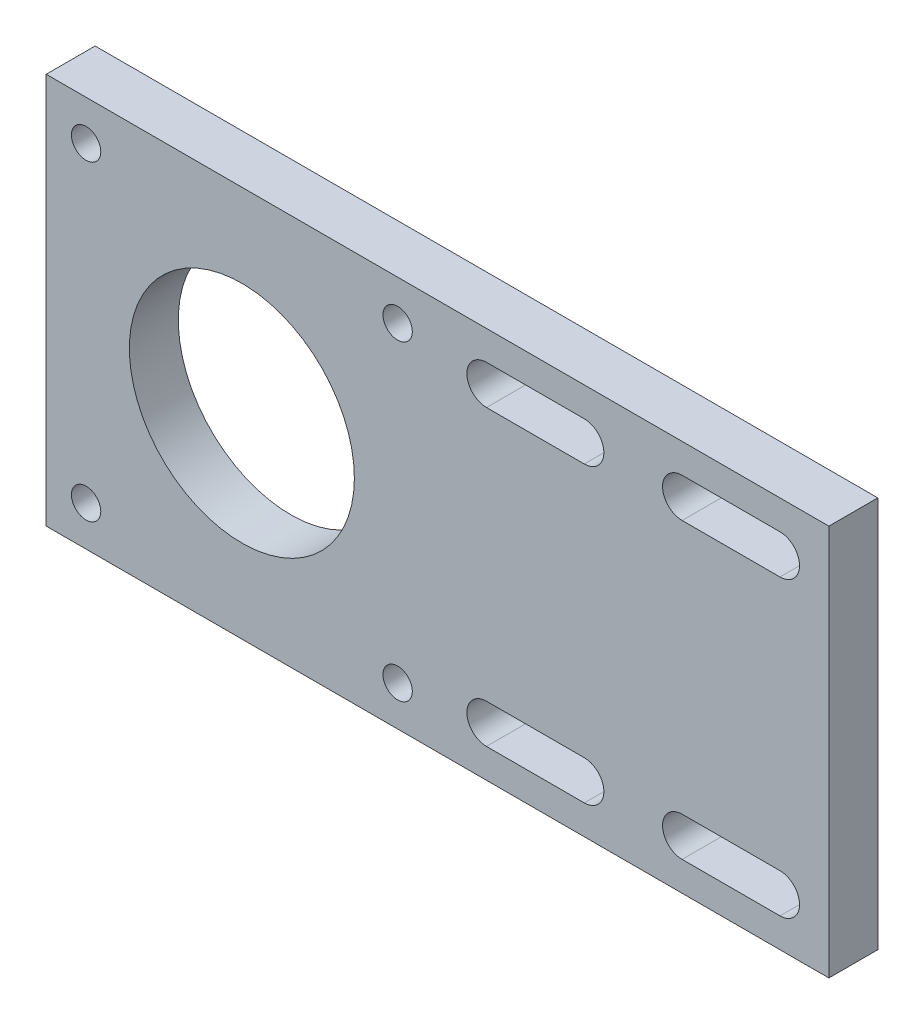
ISO-10303-21;
HEADER;
FILE_DESCRIPTION(('STEP AP214'),'2;1');
FILE_NAME('part.step','',(''),(''),'','','');
FILE_SCHEMA(('AUTOMOTIVE_DESIGN { 1 0 10303 214 1 1 1 1 }'));
ENDSEC;
DATA;
#1=APPLICATION_CONTEXT('core data for automotive mechanical design processes');
#2=APPLICATION_PROTOCOL_DEFINITION('international standard','automotive_design',2000,#1);
#3=PRODUCT_CONTEXT('',#1,'mechanical');
#4=PRODUCT('Part','Part','',(#3));
#5=PRODUCT_RELATED_PRODUCT_CATEGORY('part','',(#4));
#6=PRODUCT_DEFINITION_FORMATION('','',#4);
#7=PRODUCT_DEFINITION_CONTEXT('part definition',#1,'design');
#8=PRODUCT_DEFINITION('design','',#6,#7);
#9=PRODUCT_DEFINITION_SHAPE('','',#8);
#10=(LENGTH_UNIT() NAMED_UNIT(*) SI_UNIT(.MILLI.,.METRE.));
#11=(NAMED_UNIT(*) PLANE_ANGLE_UNIT() SI_UNIT($,.RADIAN.));
#12=(NAMED_UNIT(*) SI_UNIT($,.STERADIAN.) SOLID_ANGLE_UNIT());
#13=UNCERTAINTY_MEASURE_WITH_UNIT(LENGTH_MEASURE(1.E-05),#10,'distance_accuracy_value','');
#14=(GEOMETRIC_REPRESENTATION_CONTEXT(3) GLOBAL_UNCERTAINTY_ASSIGNED_CONTEXT((#13)) GLOBAL_UNIT_ASSIGNED_CONTEXT((#10,
#11,#12)) REPRESENTATION_CONTEXT('',''));
#15=CARTESIAN_POINT('',(0.,0.,0.));
#16=DIRECTION('',(0.,0.,1.));
#17=DIRECTION('',(1.,0.,0.));
#18=AXIS2_PLACEMENT_3D('',#15,#16,#17);
#19=CARTESIAN_POINT('',(0.,0.,5.));
#20=DIRECTION('',(0.,0.,1.));
#21=DIRECTION('',(1.,0.,0.));
#22=AXIS2_PLACEMENT_3D('',#19,#20,#21);
#23=PLANE('',#22);
#24=CARTESIAN_POINT('',(-15.922,-15.922,5.));
#25=DIRECTION('',(0.,0.,1.));
#26=DIRECTION('',(1.,0.,0.));
#27=AXIS2_PLACEMENT_3D('',#24,#25,#26);
#28=CIRCLE('',#27,1.5);
#29=CARTESIAN_POINT('',(-14.422,-15.922,5.));
#30=VERTEX_POINT('',#29);
#31=EDGE_CURVE('E475',#30,#30,#28,.T.);
#32=ORIENTED_EDGE('',*,*,#31,.F.);
#33=EDGE_LOOP('',(#32));
#34=FACE_BOUND('',#33,.T.);
#35=CARTESIAN_POINT('',(15.922,15.922,5.));
#36=DIRECTION('',(0.,0.,1.));
#37=DIRECTION('',(1.,0.,0.));
#38=AXIS2_PLACEMENT_3D('',#35,#36,#37);
#39=CIRCLE('',#38,1.5);
#40=CARTESIAN_POINT('',(17.422,15.922,5.));
#41=VERTEX_POINT('',#40);
#42=EDGE_CURVE('E487',#41,#41,#39,.T.);
#43=ORIENTED_EDGE('',*,*,#42,.F.);
#44=EDGE_LOOP('',(#43));
#45=FACE_BOUND('',#44,.T.);
#46=DIRECTION('',(1.,0.,0.));
#47=VECTOR('',#46,1.);
#48=CARTESIAN_POINT('',(25.,-17.,5.));
#49=LINE('',#48,#47);
#50=CARTESIAN_POINT('',(25.,-17.,5.));
#51=VERTEX_POINT('',#50);
#52=CARTESIAN_POINT('',(35.,-17.,5.));
#53=VERTEX_POINT('',#52);
#54=EDGE_CURVE('E178',#51,#53,#49,.T.);
#55=ORIENTED_EDGE('',*,*,#54,.F.);
#56=CARTESIAN_POINT('',(25.,-15.,5.));
#57=DIRECTION('',(0.,0.,1.));
#58=DIRECTION('',(1.,0.,0.));
#59=AXIS2_PLACEMENT_3D('',#56,#57,#58);
#60=CIRCLE('',#59,2.00000000000001);
#61=CARTESIAN_POINT('',(25.,-13.,5.));
#62=VERTEX_POINT('',#61);
#63=EDGE_CURVE('E170',#62,#51,#60,.T.);
#64=ORIENTED_EDGE('',*,*,#63,.F.);
#65=DIRECTION('',(-1.,0.,0.));
#66=VECTOR('',#65,1.);
#67=CARTESIAN_POINT('',(25.,-13.,5.));
#68=LINE('',#67,#66);
#69=CARTESIAN_POINT('',(35.,-13.,5.));
#70=VERTEX_POINT('',#69);
#71=EDGE_CURVE('E193',#70,#62,#68,.T.);
#72=ORIENTED_EDGE('',*,*,#71,.F.);
#73=CARTESIAN_POINT('',(35.,-15.,5.));
#74=DIRECTION('',(0.,0.,1.));
#75=DIRECTION('',(1.,0.,0.));
#76=AXIS2_PLACEMENT_3D('',#73,#74,#75);
#77=CIRCLE('',#76,2.00000000000001);
#78=EDGE_CURVE('E191',#53,#70,#77,.T.);
#79=ORIENTED_EDGE('',*,*,#78,.F.);
#80=EDGE_LOOP('',(#55,#64,#72,#79));
#81=FACE_BOUND('',#80,.T.);
#82=DIRECTION('',(1.,0.,0.));
#83=VECTOR('',#82,1.);
#84=CARTESIAN_POINT('',(45.,-17.,5.));
#85=LINE('',#84,#83);
#86=CARTESIAN_POINT('',(45.,-17.,5.));
#87=VERTEX_POINT('',#86);
#88=CARTESIAN_POINT('',(55.,-17.,5.));
#89=VERTEX_POINT('',#88);
#90=EDGE_CURVE('E211',#87,#89,#85,.T.);
#91=ORIENTED_EDGE('',*,*,#90,.F.);
#92=CARTESIAN_POINT('',(45.,-15.,5.));
#93=DIRECTION('',(0.,0.,1.));
#94=DIRECTION('',(1.,0.,0.));
#95=AXIS2_PLACEMENT_3D('',#92,#93,#94);
#96=CIRCLE('',#95,2.);
#97=CARTESIAN_POINT('',(45.,-13.,5.));
#98=VERTEX_POINT('',#97);
#99=EDGE_CURVE('E209',#98,#87,#96,.T.);
#100=ORIENTED_EDGE('',*,*,#99,.F.);
#101=DIRECTION('',(-1.,0.,0.));
#102=VECTOR('',#101,1.);
#103=CARTESIAN_POINT('',(45.,-13.,5.));
#104=LINE('',#103,#102);
#105=CARTESIAN_POINT('',(55.,-13.,5.));
#106=VERTEX_POINT('',#105);
#107=EDGE_CURVE('E217',#106,#98,#104,.T.);
#108=ORIENTED_EDGE('',*,*,#107,.F.);
#109=CARTESIAN_POINT('',(55.,-15.,5.));
#110=DIRECTION('',(0.,0.,1.));
#111=DIRECTION('',(1.,0.,0.));
#112=AXIS2_PLACEMENT_3D('',#109,#110,#111);
#113=CIRCLE('',#112,2.);
#114=EDGE_CURVE('E214',#89,#106,#113,.T.);
#115=ORIENTED_EDGE('',*,*,#114,.F.);
#116=EDGE_LOOP('',(#91,#100,#108,#115));
#117=FACE_BOUND('',#116,.T.);
#118=DIRECTION('',(1.,0.,0.));
#119=VECTOR('',#118,1.);
#120=CARTESIAN_POINT('',(45.,13.,5.));
#121=LINE('',#120,#119);
#122=CARTESIAN_POINT('',(45.,13.,5.));
#123=VERTEX_POINT('',#122);
#124=CARTESIAN_POINT('',(55.,13.,5.));
#125=VERTEX_POINT('',#124);
#126=EDGE_CURVE('E242',#123,#125,#121,.T.);
#127=ORIENTED_EDGE('',*,*,#126,.F.);
#128=CARTESIAN_POINT('',(45.,15.,5.));
#129=DIRECTION('',(0.,0.,1.));
#130=DIRECTION('',(1.,0.,0.));
#131=AXIS2_PLACEMENT_3D('',#128,#129,#130);
#132=CIRCLE('',#131,2.);
#133=CARTESIAN_POINT('',(45.,17.,5.));
#134=VERTEX_POINT('',#133);
#135=EDGE_CURVE('E240',#134,#123,#132,.T.);
#136=ORIENTED_EDGE('',*,*,#135,.F.);
#137=DIRECTION('',(-1.,0.,0.));
#138=VECTOR('',#137,1.);
#139=CARTESIAN_POINT('',(45.,17.,5.));
#140=LINE('',#139,#138);
#141=CARTESIAN_POINT('',(55.,17.,5.));
#142=VERTEX_POINT('',#141);
#143=EDGE_CURVE('E248',#142,#134,#140,.T.);
#144=ORIENTED_EDGE('',*,*,#143,.F.);
#145=CARTESIAN_POINT('',(55.,15.,5.));
#146=DIRECTION('',(0.,0.,1.));
#147=DIRECTION('',(1.,0.,0.));
#148=AXIS2_PLACEMENT_3D('',#145,#146,#147);
#149=CIRCLE('',#148,2.);
#150=EDGE_CURVE('E245',#125,#142,#149,.T.);
#151=ORIENTED_EDGE('',*,*,#150,.F.);
#152=EDGE_LOOP('',(#127,#136,#144,#151));
#153=FACE_BOUND('',#152,.T.);
#154=DIRECTION('',(1.,0.,0.));
#155=VECTOR('',#154,1.);
#156=CARTESIAN_POINT('',(25.,13.,5.));
#157=LINE('',#156,#155);
#158=CARTESIAN_POINT('',(25.,13.,5.));
#159=VERTEX_POINT('',#158);
#160=CARTESIAN_POINT('',(35.,13.,5.));
#161=VERTEX_POINT('',#160);
#162=EDGE_CURVE('E273',#159,#161,#157,.T.);
#163=ORIENTED_EDGE('',*,*,#162,.F.);
#164=CARTESIAN_POINT('',(25.,15.,5.));
#165=DIRECTION('',(0.,0.,1.));
#166=DIRECTION('',(1.,0.,0.));
#167=AXIS2_PLACEMENT_3D('',#164,#165,#166);
#168=CIRCLE('',#167,2.);
#169=CARTESIAN_POINT('',(25.,17.,5.));
#170=VERTEX_POINT('',#169);
#171=EDGE_CURVE('E271',#170,#159,#168,.T.);
#172=ORIENTED_EDGE('',*,*,#171,.F.);
#173=DIRECTION('',(-1.,0.,0.));
#174=VECTOR('',#173,1.);
#175=CARTESIAN_POINT('',(25.,17.,5.));
#176=LINE('',#175,#174);
#177=CARTESIAN_POINT('',(35.,17.,5.));
#178=VERTEX_POINT('',#177);
#179=EDGE_CURVE('E279',#178,#170,#176,.T.);
#180=ORIENTED_EDGE('',*,*,#179,.F.);
#181=CARTESIAN_POINT('',(35.,15.,5.));
#182=DIRECTION('',(0.,0.,1.));
#183=DIRECTION('',(1.,0.,0.));
#184=AXIS2_PLACEMENT_3D('',#181,#182,#183);
#185=CIRCLE('',#184,2.);
#186=EDGE_CURVE('E276',#161,#178,#185,.T.);
#187=ORIENTED_EDGE('',*,*,#186,.F.);
#188=EDGE_LOOP('',(#163,#172,#180,#187));
#189=FACE_BOUND('',#188,.T.);
#190=DIRECTION('',(-1.,0.,0.));
#191=VECTOR('',#190,1.);
#192=CARTESIAN_POINT('',(60.,20.,5.));
#193=LINE('',#192,#191);
#194=CARTESIAN_POINT('',(60.,20.,5.));
#195=VERTEX_POINT('',#194);
#196=CARTESIAN_POINT('',(-20.,20.,5.));
#197=VERTEX_POINT('',#196);
#198=EDGE_CURVE('E302',#195,#197,#193,.T.);
#199=ORIENTED_EDGE('',*,*,#198,.T.);
#200=DIRECTION('',(0.,-1.,0.));
#201=VECTOR('',#200,1.);
#202=CARTESIAN_POINT('',(-20.,20.,5.));
#203=LINE('',#202,#201);
#204=CARTESIAN_POINT('',(-20.,-20.,5.));
#205=VERTEX_POINT('',#204);
#206=EDGE_CURVE('E305',#197,#205,#203,.T.);
#207=ORIENTED_EDGE('',*,*,#206,.T.);
#208=DIRECTION('',(1.,0.,0.));
#209=VECTOR('',#208,1.);
#210=CARTESIAN_POINT('',(-20.,-20.,5.));
#211=LINE('',#210,#209);
#212=CARTESIAN_POINT('',(60.,-20.,5.));
#213=VERTEX_POINT('',#212);
#214=EDGE_CURVE('E308',#205,#213,#211,.T.);
#215=ORIENTED_EDGE('',*,*,#214,.T.);
#216=DIRECTION('',(0.,1.,0.));
#217=VECTOR('',#216,1.);
#218=CARTESIAN_POINT('',(60.,-20.,5.));
#219=LINE('',#218,#217);
#220=EDGE_CURVE('E310',#213,#195,#219,.T.);
#221=ORIENTED_EDGE('',*,*,#220,.T.);
#222=EDGE_LOOP('',(#199,#207,#215,#221));
#223=FACE_BOUND('',#222,.T.);
#224=CARTESIAN_POINT('',(-15.922,15.922,5.));
#225=DIRECTION('',(0.,0.,1.));
#226=DIRECTION('',(1.,0.,0.));
#227=AXIS2_PLACEMENT_3D('',#224,#225,#226);
#228=CIRCLE('',#227,1.5);
#229=CARTESIAN_POINT('',(-14.422,15.922,5.));
#230=VERTEX_POINT('',#229);
#231=EDGE_CURVE('E199',#230,#230,#228,.T.);
#232=ORIENTED_EDGE('',*,*,#231,.F.);
#233=EDGE_LOOP('',(#232));
#234=FACE_BOUND('',#233,.T.);
#235=CARTESIAN_POINT('',(15.922,-15.922,5.));
#236=DIRECTION('',(0.,0.,1.));
#237=DIRECTION('',(1.,0.,0.));
#238=AXIS2_PLACEMENT_3D('',#235,#236,#237);
#239=CIRCLE('',#238,1.5);
#240=CARTESIAN_POINT('',(17.422,-15.922,5.));
#241=VERTEX_POINT('',#240);
#242=EDGE_CURVE('E481',#241,#241,#239,.T.);
#243=ORIENTED_EDGE('',*,*,#242,.F.);
#244=EDGE_LOOP('',(#243));
#245=FACE_BOUND('',#244,.T.);
#246=CARTESIAN_POINT('',(0.,0.,5.));
#247=DIRECTION('',(0.,0.,1.));
#248=DIRECTION('',(1.,0.,0.));
#249=AXIS2_PLACEMENT_3D('',#246,#247,#248);
#250=CIRCLE('',#249,11.5);
#251=CARTESIAN_POINT('',(11.5,0.,5.));
#252=VERTEX_POINT('',#251);
#253=EDGE_CURVE('E466',#252,#252,#250,.T.);
#254=ORIENTED_EDGE('',*,*,#253,.F.);
#255=EDGE_LOOP('',(#254));
#256=FACE_BOUND('',#255,.T.);
#257=ADVANCED_FACE('F33',(#34,#45,#81,#117,#153,#189,#223,#234,#245,#256),#23,.T.);
#258=CARTESIAN_POINT('',(0.,0.,0.));
#259=DIRECTION('',(0.,0.,1.));
#260=DIRECTION('',(1.,0.,0.));
#261=AXIS2_PLACEMENT_3D('',#258,#259,#260);
#262=PLANE('',#261);
#263=CARTESIAN_POINT('',(45.,-15.,0.));
#264=DIRECTION('',(0.,0.,1.));
#265=DIRECTION('',(1.,0.,0.));
#266=AXIS2_PLACEMENT_3D('',#263,#264,#265);
#267=CIRCLE('',#266,2.);
#268=CARTESIAN_POINT('',(45.,-13.,0.));
#269=VERTEX_POINT('',#268);
#270=CARTESIAN_POINT('',(45.,-17.,0.));
#271=VERTEX_POINT('',#270);
#272=EDGE_CURVE('E186',#269,#271,#267,.T.);
#273=ORIENTED_EDGE('',*,*,#272,.T.);
#274=DIRECTION('',(1.,0.,0.));
#275=VECTOR('',#274,1.);
#276=CARTESIAN_POINT('',(45.,-17.,0.));
#277=LINE('',#276,#275);
#278=CARTESIAN_POINT('',(55.,-17.,0.));
#279=VERTEX_POINT('',#278);
#280=EDGE_CURVE('E222',#271,#279,#277,.T.);
#281=ORIENTED_EDGE('',*,*,#280,.T.);
#282=CARTESIAN_POINT('',(55.,-15.,0.));
#283=DIRECTION('',(0.,0.,1.));
#284=DIRECTION('',(1.,0.,0.));
#285=AXIS2_PLACEMENT_3D('',#282,#283,#284);
#286=CIRCLE('',#285,2.);
#287=CARTESIAN_POINT('',(55.,-13.,0.));
#288=VERTEX_POINT('',#287);
#289=EDGE_CURVE('E225',#279,#288,#286,.T.);
#290=ORIENTED_EDGE('',*,*,#289,.T.);
#291=DIRECTION('',(-1.,0.,0.));
#292=VECTOR('',#291,1.);
#293=CARTESIAN_POINT('',(45.,-13.,0.));
#294=LINE('',#293,#292);
#295=EDGE_CURVE('E212',#288,#269,#294,.T.);
#296=ORIENTED_EDGE('',*,*,#295,.T.);
#297=EDGE_LOOP('',(#273,#281,#290,#296));
#298=FACE_BOUND('',#297,.T.);
#299=CARTESIAN_POINT('',(25.,15.,0.));
#300=DIRECTION('',(0.,0.,1.));
#301=DIRECTION('',(1.,0.,0.));
#302=AXIS2_PLACEMENT_3D('',#299,#300,#301);
#303=CIRCLE('',#302,2.);
#304=CARTESIAN_POINT('',(25.,17.,0.));
#305=VERTEX_POINT('',#304);
#306=CARTESIAN_POINT('',(25.,13.,0.));
#307=VERTEX_POINT('',#306);
#308=EDGE_CURVE('E270',#305,#307,#303,.T.);
#309=ORIENTED_EDGE('',*,*,#308,.T.);
#310=DIRECTION('',(1.,0.,0.));
#311=VECTOR('',#310,1.);
#312=CARTESIAN_POINT('',(25.,13.,0.));
#313=LINE('',#312,#311);
#314=CARTESIAN_POINT('',(35.,13.,0.));
#315=VERTEX_POINT('',#314);
#316=EDGE_CURVE('E284',#307,#315,#313,.T.);
#317=ORIENTED_EDGE('',*,*,#316,.T.);
#318=CARTESIAN_POINT('',(35.,15.,0.));
#319=DIRECTION('',(0.,0.,1.));
#320=DIRECTION('',(1.,0.,0.));
#321=AXIS2_PLACEMENT_3D('',#318,#319,#320);
#322=CIRCLE('',#321,2.);
#323=CARTESIAN_POINT('',(35.,17.,0.));
#324=VERTEX_POINT('',#323);
#325=EDGE_CURVE('E287',#315,#324,#322,.T.);
#326=ORIENTED_EDGE('',*,*,#325,.T.);
#327=DIRECTION('',(-1.,0.,0.));
#328=VECTOR('',#327,1.);
#329=CARTESIAN_POINT('',(25.,17.,0.));
#330=LINE('',#329,#328);
#331=EDGE_CURVE('E274',#324,#305,#330,.T.);
#332=ORIENTED_EDGE('',*,*,#331,.T.);
#333=EDGE_LOOP('',(#309,#317,#326,#332));
#334=FACE_BOUND('',#333,.T.);
#335=DIRECTION('',(-1.,0.,0.));
#336=VECTOR('',#335,1.);
#337=CARTESIAN_POINT('',(60.,20.,0.));
#338=LINE('',#337,#336);
#339=CARTESIAN_POINT('',(60.,20.,0.));
#340=VERTEX_POINT('',#339);
#341=CARTESIAN_POINT('',(-20.,20.,0.));
#342=VERTEX_POINT('',#341);
#343=EDGE_CURVE('E301',#340,#342,#338,.T.);
#344=ORIENTED_EDGE('',*,*,#343,.F.);
#345=DIRECTION('',(0.,1.,0.));
#346=VECTOR('',#345,1.);
#347=CARTESIAN_POINT('',(60.,-20.,0.));
#348=LINE('',#347,#346);
#349=CARTESIAN_POINT('',(60.,-20.,0.));
#350=VERTEX_POINT('',#349);
#351=EDGE_CURVE('E306',#350,#340,#348,.T.);
#352=ORIENTED_EDGE('',*,*,#351,.F.);
#353=DIRECTION('',(1.,0.,0.));
#354=VECTOR('',#353,1.);
#355=CARTESIAN_POINT('',(-20.,-20.,0.));
#356=LINE('',#355,#354);
#357=CARTESIAN_POINT('',(-20.,-20.,0.));
#358=VERTEX_POINT('',#357);
#359=EDGE_CURVE('E317',#358,#350,#356,.T.);
#360=ORIENTED_EDGE('',*,*,#359,.F.);
#361=DIRECTION('',(0.,-1.,0.));
#362=VECTOR('',#361,1.);
#363=CARTESIAN_POINT('',(-20.,20.,0.));
#364=LINE('',#363,#362);
#365=EDGE_CURVE('E315',#342,#358,#364,.T.);
#366=ORIENTED_EDGE('',*,*,#365,.F.);
#367=EDGE_LOOP('',(#344,#352,#360,#366));
#368=FACE_BOUND('',#367,.T.);
#369=CARTESIAN_POINT('',(45.,15.,0.));
#370=DIRECTION('',(0.,0.,1.));
#371=DIRECTION('',(1.,0.,0.));
#372=AXIS2_PLACEMENT_3D('',#369,#370,#371);
#373=CIRCLE('',#372,2.);
#374=CARTESIAN_POINT('',(45.,17.,0.));
#375=VERTEX_POINT('',#374);
#376=CARTESIAN_POINT('',(45.,13.,0.));
#377=VERTEX_POINT('',#376);
#378=EDGE_CURVE('E239',#375,#377,#373,.T.);
#379=ORIENTED_EDGE('',*,*,#378,.T.);
#380=DIRECTION('',(1.,0.,0.));
#381=VECTOR('',#380,1.);
#382=CARTESIAN_POINT('',(45.,13.,0.));
#383=LINE('',#382,#381);
#384=CARTESIAN_POINT('',(55.,13.,0.));
#385=VERTEX_POINT('',#384);
#386=EDGE_CURVE('E253',#377,#385,#383,.T.);
#387=ORIENTED_EDGE('',*,*,#386,.T.);
#388=CARTESIAN_POINT('',(55.,15.,0.));
#389=DIRECTION('',(0.,0.,1.));
#390=DIRECTION('',(1.,0.,0.));
#391=AXIS2_PLACEMENT_3D('',#388,#389,#390);
#392=CIRCLE('',#391,2.);
#393=CARTESIAN_POINT('',(55.,17.,0.));
#394=VERTEX_POINT('',#393);
#395=EDGE_CURVE('E256',#385,#394,#392,.T.);
#396=ORIENTED_EDGE('',*,*,#395,.T.);
#397=DIRECTION('',(-1.,0.,0.));
#398=VECTOR('',#397,1.);
#399=CARTESIAN_POINT('',(45.,17.,0.));
#400=LINE('',#399,#398);
#401=EDGE_CURVE('E243',#394,#375,#400,.T.);
#402=ORIENTED_EDGE('',*,*,#401,.T.);
#403=EDGE_LOOP('',(#379,#387,#396,#402));
#404=FACE_BOUND('',#403,.T.);
#405=CARTESIAN_POINT('',(25.,-15.,0.));
#406=DIRECTION('',(0.,0.,1.));
#407=DIRECTION('',(1.,0.,0.));
#408=AXIS2_PLACEMENT_3D('',#405,#406,#407);
#409=CIRCLE('',#408,2.00000000000001);
#410=CARTESIAN_POINT('',(25.,-13.,0.));
#411=VERTEX_POINT('',#410);
#412=CARTESIAN_POINT('',(25.,-17.,0.));
#413=VERTEX_POINT('',#412);
#414=EDGE_CURVE('E56',#411,#413,#409,.T.);
#415=ORIENTED_EDGE('',*,*,#414,.T.);
#416=DIRECTION('',(1.,0.,0.));
#417=VECTOR('',#416,1.);
#418=CARTESIAN_POINT('',(25.,-17.,0.));
#419=LINE('',#418,#417);
#420=CARTESIAN_POINT('',(35.,-17.,0.));
#421=VERTEX_POINT('',#420);
#422=EDGE_CURVE('E185',#413,#421,#419,.T.);
#423=ORIENTED_EDGE('',*,*,#422,.T.);
#424=CARTESIAN_POINT('',(35.,-15.,0.));
#425=DIRECTION('',(0.,0.,1.));
#426=DIRECTION('',(1.,0.,0.));
#427=AXIS2_PLACEMENT_3D('',#424,#425,#426);
#428=CIRCLE('',#427,2.00000000000001);
#429=CARTESIAN_POINT('',(35.,-13.,0.));
#430=VERTEX_POINT('',#429);
#431=EDGE_CURVE('E201',#421,#430,#428,.T.);
#432=ORIENTED_EDGE('',*,*,#431,.T.);
#433=DIRECTION('',(-1.,0.,0.));
#434=VECTOR('',#433,1.);
#435=CARTESIAN_POINT('',(25.,-13.,0.));
#436=LINE('',#435,#434);
#437=EDGE_CURVE('E179',#430,#411,#436,.T.);
#438=ORIENTED_EDGE('',*,*,#437,.T.);
#439=EDGE_LOOP('',(#415,#423,#432,#438));
#440=FACE_BOUND('',#439,.T.);
#441=CARTESIAN_POINT('',(-15.922,15.922,0.));
#442=DIRECTION('',(0.,0.,1.));
#443=DIRECTION('',(1.,0.,0.));
#444=AXIS2_PLACEMENT_3D('',#441,#442,#443);
#445=CIRCLE('',#444,1.5);
#446=CARTESIAN_POINT('',(-14.422,15.922,0.));
#447=VERTEX_POINT('',#446);
#448=EDGE_CURVE('E490',#447,#447,#445,.T.);
#449=ORIENTED_EDGE('',*,*,#448,.T.);
#450=EDGE_LOOP('',(#449));
#451=FACE_BOUND('',#450,.T.);
#452=CARTESIAN_POINT('',(15.922,15.922,0.));
#453=DIRECTION('',(0.,0.,1.));
#454=DIRECTION('',(1.,0.,0.));
#455=AXIS2_PLACEMENT_3D('',#452,#453,#454);
#456=CIRCLE('',#455,1.5);
#457=CARTESIAN_POINT('',(17.422,15.922,0.));
#458=VERTEX_POINT('',#457);
#459=EDGE_CURVE('E484',#458,#458,#456,.T.);
#460=ORIENTED_EDGE('',*,*,#459,.T.);
#461=EDGE_LOOP('',(#460));
#462=FACE_BOUND('',#461,.T.);
#463=CARTESIAN_POINT('',(15.922,-15.922,0.));
#464=DIRECTION('',(0.,0.,1.));
#465=DIRECTION('',(1.,0.,0.));
#466=AXIS2_PLACEMENT_3D('',#463,#464,#465);
#467=CIRCLE('',#466,1.5);
#468=CARTESIAN_POINT('',(17.422,-15.922,0.));
#469=VERTEX_POINT('',#468);
#470=EDGE_CURVE('E478',#469,#469,#467,.T.);
#471=ORIENTED_EDGE('',*,*,#470,.T.);
#472=EDGE_LOOP('',(#471));
#473=FACE_BOUND('',#472,.T.);
#474=CARTESIAN_POINT('',(-15.922,-15.922,0.));
#475=DIRECTION('',(0.,0.,1.));
#476=DIRECTION('',(1.,0.,0.));
#477=AXIS2_PLACEMENT_3D('',#474,#475,#476);
#478=CIRCLE('',#477,1.5);
#479=CARTESIAN_POINT('',(-14.422,-15.922,0.));
#480=VERTEX_POINT('',#479);
#481=EDGE_CURVE('E472',#480,#480,#478,.T.);
#482=ORIENTED_EDGE('',*,*,#481,.T.);
#483=EDGE_LOOP('',(#482));
#484=FACE_BOUND('',#483,.T.);
#485=CARTESIAN_POINT('',(0.,0.,0.));
#486=DIRECTION('',(0.,0.,1.));
#487=DIRECTION('',(1.,0.,0.));
#488=AXIS2_PLACEMENT_3D('',#485,#486,#487);
#489=CIRCLE('',#488,11.5);
#490=CARTESIAN_POINT('',(11.5,0.,0.));
#491=VERTEX_POINT('',#490);
#492=EDGE_CURVE('E469',#491,#491,#489,.T.);
#493=ORIENTED_EDGE('',*,*,#492,.T.);
#494=EDGE_LOOP('',(#493));
#495=FACE_BOUND('',#494,.T.);
#496=ADVANCED_FACE('F335',(#298,#334,#368,#404,#440,#451,#462,#473,#484,#495),#262,.F.);
#497=CARTESIAN_POINT('',(60.,20.,5.));
#498=DIRECTION('',(0.,-1.,0.));
#499=DIRECTION('',(0.,0.,-1.));
#500=AXIS2_PLACEMENT_3D('',#497,#498,#499);
#501=PLANE('',#500);
#502=ORIENTED_EDGE('',*,*,#343,.T.);
#503=DIRECTION('',(0.,0.,-1.));
#504=VECTOR('',#503,1.);
#505=CARTESIAN_POINT('',(-20.,20.,5.));
#506=LINE('',#505,#504);
#507=EDGE_CURVE('E11',#197,#342,#506,.T.);
#508=ORIENTED_EDGE('',*,*,#507,.F.);
#509=ORIENTED_EDGE('',*,*,#198,.F.);
#510=DIRECTION('',(0.,0.,-1.));
#511=VECTOR('',#510,1.);
#512=CARTESIAN_POINT('',(60.,20.,5.));
#513=LINE('',#512,#511);
#514=EDGE_CURVE('E312',#195,#340,#513,.T.);
#515=ORIENTED_EDGE('',*,*,#514,.T.);
#516=EDGE_LOOP('',(#502,#508,#509,#515));
#517=FACE_BOUND('',#516,.T.);
#518=ADVANCED_FACE('F35',(#517),#501,.F.);
#519=CARTESIAN_POINT('',(-20.,20.,5.));
#520=DIRECTION('',(1.,0.,0.));
#521=DIRECTION('',(0.,0.,-1.));
#522=AXIS2_PLACEMENT_3D('',#519,#520,#521);
#523=PLANE('',#522);
#524=ORIENTED_EDGE('',*,*,#365,.T.);
#525=DIRECTION('',(0.,0.,-1.));
#526=VECTOR('',#525,1.);
#527=CARTESIAN_POINT('',(-20.,-20.,5.));
#528=LINE('',#527,#526);
#529=EDGE_CURVE('E41',#205,#358,#528,.T.);
#530=ORIENTED_EDGE('',*,*,#529,.F.);
#531=ORIENTED_EDGE('',*,*,#206,.F.);
#532=ORIENTED_EDGE('',*,*,#507,.T.);
#533=EDGE_LOOP('',(#524,#530,#531,#532));
#534=FACE_BOUND('',#533,.T.);
#535=ADVANCED_FACE('F346',(#534),#523,.F.);
#536=CARTESIAN_POINT('',(-20.,-20.,5.));
#537=DIRECTION('',(0.,1.,0.));
#538=DIRECTION('',(0.,0.,1.));
#539=AXIS2_PLACEMENT_3D('',#536,#537,#538);
#540=PLANE('',#539);
#541=ORIENTED_EDGE('',*,*,#359,.T.);
#542=DIRECTION('',(0.,0.,-1.));
#543=VECTOR('',#542,1.);
#544=CARTESIAN_POINT('',(60.,-20.,5.));
#545=LINE('',#544,#543);
#546=EDGE_CURVE('E322',#213,#350,#545,.T.);
#547=ORIENTED_EDGE('',*,*,#546,.F.);
#548=ORIENTED_EDGE('',*,*,#214,.F.);
#549=ORIENTED_EDGE('',*,*,#529,.T.);
#550=EDGE_LOOP('',(#541,#547,#548,#549));
#551=FACE_BOUND('',#550,.T.);
#552=ADVANCED_FACE('F329',(#551),#540,.F.);
#553=CARTESIAN_POINT('',(60.,-20.,5.));
#554=DIRECTION('',(-1.,0.,0.));
#555=DIRECTION('',(0.,0.,1.));
#556=AXIS2_PLACEMENT_3D('',#553,#554,#555);
#557=PLANE('',#556);
#558=ORIENTED_EDGE('',*,*,#351,.T.);
#559=ORIENTED_EDGE('',*,*,#514,.F.);
#560=ORIENTED_EDGE('',*,*,#220,.F.);
#561=ORIENTED_EDGE('',*,*,#546,.T.);
#562=EDGE_LOOP('',(#558,#559,#560,#561));
#563=FACE_BOUND('',#562,.T.);
#564=ADVANCED_FACE('F339',(#563),#557,.F.);
#565=CARTESIAN_POINT('',(25.,15.,5.));
#566=DIRECTION('',(0.,0.,-1.));
#567=DIRECTION('',(-1.,0.,0.));
#568=AXIS2_PLACEMENT_3D('',#565,#566,#567);
#569=CYLINDRICAL_SURFACE('',#568,2.);
#570=ORIENTED_EDGE('',*,*,#308,.F.);
#571=DIRECTION('',(0.,0.,-1.));
#572=VECTOR('',#571,1.);
#573=CARTESIAN_POINT('',(25.,17.,5.));
#574=LINE('',#573,#572);
#575=EDGE_CURVE('E281',#170,#305,#574,.T.);
#576=ORIENTED_EDGE('',*,*,#575,.F.);
#577=ORIENTED_EDGE('',*,*,#171,.T.);
#578=DIRECTION('',(0.,0.,-1.));
#579=VECTOR('',#578,1.);
#580=CARTESIAN_POINT('',(25.,13.,5.));
#581=LINE('',#580,#579);
#582=EDGE_CURVE('E298',#159,#307,#581,.T.);
#583=ORIENTED_EDGE('',*,*,#582,.T.);
#584=EDGE_LOOP('',(#570,#576,#577,#583));
#585=FACE_BOUND('',#584,.T.);
#586=ADVANCED_FACE('F364',(#585),#569,.F.);
#587=CARTESIAN_POINT('',(25.,13.,5.));
#588=DIRECTION('',(0.,1.,0.));
#589=DIRECTION('',(0.,0.,1.));
#590=AXIS2_PLACEMENT_3D('',#587,#588,#589);
#591=PLANE('',#590);
#592=ORIENTED_EDGE('',*,*,#316,.F.);
#593=ORIENTED_EDGE('',*,*,#582,.F.);
#594=ORIENTED_EDGE('',*,*,#162,.T.);
#595=DIRECTION('',(0.,0.,-1.));
#596=VECTOR('',#595,1.);
#597=CARTESIAN_POINT('',(35.,13.,5.));
#598=LINE('',#597,#596);
#599=EDGE_CURVE('E296',#161,#315,#598,.T.);
#600=ORIENTED_EDGE('',*,*,#599,.T.);
#601=EDGE_LOOP('',(#592,#593,#594,#600));
#602=FACE_BOUND('',#601,.T.);
#603=ADVANCED_FACE('F371',(#602),#591,.T.);
#604=CARTESIAN_POINT('',(35.,15.,5.));
#605=DIRECTION('',(0.,0.,-1.));
#606=DIRECTION('',(-1.,0.,0.));
#607=AXIS2_PLACEMENT_3D('',#604,#605,#606);
#608=CYLINDRICAL_SURFACE('',#607,2.);
#609=ORIENTED_EDGE('',*,*,#325,.F.);
#610=ORIENTED_EDGE('',*,*,#599,.F.);
#611=ORIENTED_EDGE('',*,*,#186,.T.);
#612=DIRECTION('',(0.,0.,-1.));
#613=VECTOR('',#612,1.);
#614=CARTESIAN_POINT('',(35.,17.,5.));
#615=LINE('',#614,#613);
#616=EDGE_CURVE('E294',#178,#324,#615,.T.);
#617=ORIENTED_EDGE('',*,*,#616,.T.);
#618=EDGE_LOOP('',(#609,#610,#611,#617));
#619=FACE_BOUND('',#618,.T.);
#620=ADVANCED_FACE('F376',(#619),#608,.F.);
#621=CARTESIAN_POINT('',(25.,17.,5.));
#622=DIRECTION('',(0.,-1.,0.));
#623=DIRECTION('',(0.,0.,-1.));
#624=AXIS2_PLACEMENT_3D('',#621,#622,#623);
#625=PLANE('',#624);
#626=ORIENTED_EDGE('',*,*,#331,.F.);
#627=ORIENTED_EDGE('',*,*,#616,.F.);
#628=ORIENTED_EDGE('',*,*,#179,.T.);
#629=ORIENTED_EDGE('',*,*,#575,.T.);
#630=EDGE_LOOP('',(#626,#627,#628,#629));
#631=FACE_BOUND('',#630,.T.);
#632=ADVANCED_FACE('F384',(#631),#625,.T.);
#633=CARTESIAN_POINT('',(45.,15.,5.));
#634=DIRECTION('',(0.,0.,-1.));
#635=DIRECTION('',(-1.,0.,0.));
#636=AXIS2_PLACEMENT_3D('',#633,#634,#635);
#637=CYLINDRICAL_SURFACE('',#636,2.);
#638=ORIENTED_EDGE('',*,*,#378,.F.);
#639=DIRECTION('',(0.,0.,-1.));
#640=VECTOR('',#639,1.);
#641=CARTESIAN_POINT('',(45.,17.,5.));
#642=LINE('',#641,#640);
#643=EDGE_CURVE('E250',#134,#375,#642,.T.);
#644=ORIENTED_EDGE('',*,*,#643,.F.);
#645=ORIENTED_EDGE('',*,*,#135,.T.);
#646=DIRECTION('',(0.,0.,-1.));
#647=VECTOR('',#646,1.);
#648=CARTESIAN_POINT('',(45.,13.,5.));
#649=LINE('',#648,#647);
#650=EDGE_CURVE('E267',#123,#377,#649,.T.);
#651=ORIENTED_EDGE('',*,*,#650,.T.);
#652=EDGE_LOOP('',(#638,#644,#645,#651));
#653=FACE_BOUND('',#652,.T.);
#654=ADVANCED_FACE('F397',(#653),#637,.F.);
#655=CARTESIAN_POINT('',(45.,13.,5.));
#656=DIRECTION('',(0.,1.,0.));
#657=DIRECTION('',(0.,0.,1.));
#658=AXIS2_PLACEMENT_3D('',#655,#656,#657);
#659=PLANE('',#658);
#660=ORIENTED_EDGE('',*,*,#386,.F.);
#661=ORIENTED_EDGE('',*,*,#650,.F.);
#662=ORIENTED_EDGE('',*,*,#126,.T.);
#663=DIRECTION('',(0.,0.,-1.));
#664=VECTOR('',#663,1.);
#665=CARTESIAN_POINT('',(55.,13.,5.));
#666=LINE('',#665,#664);
#667=EDGE_CURVE('E265',#125,#385,#666,.T.);
#668=ORIENTED_EDGE('',*,*,#667,.T.);
#669=EDGE_LOOP('',(#660,#661,#662,#668));
#670=FACE_BOUND('',#669,.T.);
#671=ADVANCED_FACE('F402',(#670),#659,.T.);
#672=CARTESIAN_POINT('',(55.,15.,5.));
#673=DIRECTION('',(0.,0.,-1.));
#674=DIRECTION('',(-1.,0.,0.));
#675=AXIS2_PLACEMENT_3D('',#672,#673,#674);
#676=CYLINDRICAL_SURFACE('',#675,2.);
#677=ORIENTED_EDGE('',*,*,#395,.F.);
#678=ORIENTED_EDGE('',*,*,#667,.F.);
#679=ORIENTED_EDGE('',*,*,#150,.T.);
#680=DIRECTION('',(0.,0.,-1.));
#681=VECTOR('',#680,1.);
#682=CARTESIAN_POINT('',(55.,17.,5.));
#683=LINE('',#682,#681);
#684=EDGE_CURVE('E263',#142,#394,#683,.T.);
#685=ORIENTED_EDGE('',*,*,#684,.T.);
#686=EDGE_LOOP('',(#677,#678,#679,#685));
#687=FACE_BOUND('',#686,.T.);
#688=ADVANCED_FACE('F406',(#687),#676,.F.);
#689=CARTESIAN_POINT('',(45.,17.,5.));
#690=DIRECTION('',(0.,-1.,0.));
#691=DIRECTION('',(0.,0.,-1.));
#692=AXIS2_PLACEMENT_3D('',#689,#690,#691);
#693=PLANE('',#692);
#694=ORIENTED_EDGE('',*,*,#401,.F.);
#695=ORIENTED_EDGE('',*,*,#684,.F.);
#696=ORIENTED_EDGE('',*,*,#143,.T.);
#697=ORIENTED_EDGE('',*,*,#643,.T.);
#698=EDGE_LOOP('',(#694,#695,#696,#697));
#699=FACE_BOUND('',#698,.T.);
#700=ADVANCED_FACE('F410',(#699),#693,.T.);
#701=CARTESIAN_POINT('',(45.,-15.,5.));
#702=DIRECTION('',(0.,0.,-1.));
#703=DIRECTION('',(-1.,0.,0.));
#704=AXIS2_PLACEMENT_3D('',#701,#702,#703);
#705=CYLINDRICAL_SURFACE('',#704,2.);
#706=ORIENTED_EDGE('',*,*,#272,.F.);
#707=DIRECTION('',(0.,0.,-1.));
#708=VECTOR('',#707,1.);
#709=CARTESIAN_POINT('',(45.,-13.,5.));
#710=LINE('',#709,#708);
#711=EDGE_CURVE('E219',#98,#269,#710,.T.);
#712=ORIENTED_EDGE('',*,*,#711,.F.);
#713=ORIENTED_EDGE('',*,*,#99,.T.);
#714=DIRECTION('',(0.,0.,-1.));
#715=VECTOR('',#714,1.);
#716=CARTESIAN_POINT('',(45.,-17.,5.));
#717=LINE('',#716,#715);
#718=EDGE_CURVE('E236',#87,#271,#717,.T.);
#719=ORIENTED_EDGE('',*,*,#718,.T.);
#720=EDGE_LOOP('',(#706,#712,#713,#719));
#721=FACE_BOUND('',#720,.T.);
#722=ADVANCED_FACE('F414',(#721),#705,.F.);
#723=CARTESIAN_POINT('',(45.,-17.,5.));
#724=DIRECTION('',(0.,1.,0.));
#725=DIRECTION('',(0.,0.,1.));
#726=AXIS2_PLACEMENT_3D('',#723,#724,#725);
#727=PLANE('',#726);
#728=ORIENTED_EDGE('',*,*,#280,.F.);
#729=ORIENTED_EDGE('',*,*,#718,.F.);
#730=ORIENTED_EDGE('',*,*,#90,.T.);
#731=DIRECTION('',(0.,0.,-1.));
#732=VECTOR('',#731,1.);
#733=CARTESIAN_POINT('',(55.,-17.,5.));
#734=LINE('',#733,#732);
#735=EDGE_CURVE('E234',#89,#279,#734,.T.);
#736=ORIENTED_EDGE('',*,*,#735,.T.);
#737=EDGE_LOOP('',(#728,#729,#730,#736));
#738=FACE_BOUND('',#737,.T.);
#739=ADVANCED_FACE('F418',(#738),#727,.T.);
#740=CARTESIAN_POINT('',(55.,-15.,5.));
#741=DIRECTION('',(0.,0.,-1.));
#742=DIRECTION('',(-1.,0.,0.));
#743=AXIS2_PLACEMENT_3D('',#740,#741,#742);
#744=CYLINDRICAL_SURFACE('',#743,2.);
#745=ORIENTED_EDGE('',*,*,#289,.F.);
#746=ORIENTED_EDGE('',*,*,#735,.F.);
#747=ORIENTED_EDGE('',*,*,#114,.T.);
#748=DIRECTION('',(0.,0.,-1.));
#749=VECTOR('',#748,1.);
#750=CARTESIAN_POINT('',(55.,-13.,5.));
#751=LINE('',#750,#749);
#752=EDGE_CURVE('E232',#106,#288,#751,.T.);
#753=ORIENTED_EDGE('',*,*,#752,.T.);
#754=EDGE_LOOP('',(#745,#746,#747,#753));
#755=FACE_BOUND('',#754,.T.);
#756=ADVANCED_FACE('F422',(#755),#744,.F.);
#757=CARTESIAN_POINT('',(45.,-13.,5.));
#758=DIRECTION('',(0.,-1.,0.));
#759=DIRECTION('',(0.,0.,-1.));
#760=AXIS2_PLACEMENT_3D('',#757,#758,#759);
#761=PLANE('',#760);
#762=ORIENTED_EDGE('',*,*,#295,.F.);
#763=ORIENTED_EDGE('',*,*,#752,.F.);
#764=ORIENTED_EDGE('',*,*,#107,.T.);
#765=ORIENTED_EDGE('',*,*,#711,.T.);
#766=EDGE_LOOP('',(#762,#763,#764,#765));
#767=FACE_BOUND('',#766,.T.);
#768=ADVANCED_FACE('F426',(#767),#761,.T.);
#769=CARTESIAN_POINT('',(25.,-15.,5.));
#770=DIRECTION('',(0.,0.,-1.));
#771=DIRECTION('',(-1.,0.,0.));
#772=AXIS2_PLACEMENT_3D('',#769,#770,#771);
#773=CYLINDRICAL_SURFACE('',#772,2.00000000000001);
#774=ORIENTED_EDGE('',*,*,#414,.F.);
#775=DIRECTION('',(0.,0.,-1.));
#776=VECTOR('',#775,1.);
#777=CARTESIAN_POINT('',(25.,-13.,5.));
#778=LINE('',#777,#776);
#779=EDGE_CURVE('E174',#62,#411,#778,.T.);
#780=ORIENTED_EDGE('',*,*,#779,.F.);
#781=ORIENTED_EDGE('',*,*,#63,.T.);
#782=DIRECTION('',(0.,0.,-1.));
#783=VECTOR('',#782,1.);
#784=CARTESIAN_POINT('',(25.,-17.,5.));
#785=LINE('',#784,#783);
#786=EDGE_CURVE('E173',#51,#413,#785,.T.);
#787=ORIENTED_EDGE('',*,*,#786,.T.);
#788=EDGE_LOOP('',(#774,#780,#781,#787));
#789=FACE_BOUND('',#788,.T.);
#790=ADVANCED_FACE('F172',(#789),#773,.F.);
#791=CARTESIAN_POINT('',(25.,-17.,5.));
#792=DIRECTION('',(0.,1.,0.));
#793=DIRECTION('',(0.,0.,1.));
#794=AXIS2_PLACEMENT_3D('',#791,#792,#793);
#795=PLANE('',#794);
#796=ORIENTED_EDGE('',*,*,#422,.F.);
#797=ORIENTED_EDGE('',*,*,#786,.F.);
#798=ORIENTED_EDGE('',*,*,#54,.T.);
#799=DIRECTION('',(0.,0.,-1.));
#800=VECTOR('',#799,1.);
#801=CARTESIAN_POINT('',(35.,-17.,5.));
#802=LINE('',#801,#800);
#803=EDGE_CURVE('E187',#53,#421,#802,.T.);
#804=ORIENTED_EDGE('',*,*,#803,.T.);
#805=EDGE_LOOP('',(#796,#797,#798,#804));
#806=FACE_BOUND('',#805,.T.);
#807=ADVANCED_FACE('F182',(#806),#795,.T.);
#808=CARTESIAN_POINT('',(35.,-15.,5.));
#809=DIRECTION('',(0.,0.,-1.));
#810=DIRECTION('',(-1.,0.,0.));
#811=AXIS2_PLACEMENT_3D('',#808,#809,#810);
#812=CYLINDRICAL_SURFACE('',#811,2.00000000000001);
#813=ORIENTED_EDGE('',*,*,#431,.F.);
#814=ORIENTED_EDGE('',*,*,#803,.F.);
#815=ORIENTED_EDGE('',*,*,#78,.T.);
#816=DIRECTION('',(0.,0.,-1.));
#817=VECTOR('',#816,1.);
#818=CARTESIAN_POINT('',(35.,-13.,5.));
#819=LINE('',#818,#817);
#820=EDGE_CURVE('E48',#70,#430,#819,.T.);
#821=ORIENTED_EDGE('',*,*,#820,.T.);
#822=EDGE_LOOP('',(#813,#814,#815,#821));
#823=FACE_BOUND('',#822,.T.);
#824=ADVANCED_FACE('F435',(#823),#812,.F.);
#825=CARTESIAN_POINT('',(25.,-13.,5.));
#826=DIRECTION('',(0.,-1.,0.));
#827=DIRECTION('',(0.,0.,-1.));
#828=AXIS2_PLACEMENT_3D('',#825,#826,#827);
#829=PLANE('',#828);
#830=ORIENTED_EDGE('',*,*,#437,.F.);
#831=ORIENTED_EDGE('',*,*,#820,.F.);
#832=ORIENTED_EDGE('',*,*,#71,.T.);
#833=ORIENTED_EDGE('',*,*,#779,.T.);
#834=EDGE_LOOP('',(#830,#831,#832,#833));
#835=FACE_BOUND('',#834,.T.);
#836=ADVANCED_FACE('F438',(#835),#829,.T.);
#837=CARTESIAN_POINT('',(-15.922,15.922,5.));
#838=DIRECTION('',(0.,0.,-1.));
#839=DIRECTION('',(-1.,0.,0.));
#840=AXIS2_PLACEMENT_3D('',#837,#838,#839);
#841=CYLINDRICAL_SURFACE('',#840,1.5);
#842=ORIENTED_EDGE('',*,*,#231,.T.);
#843=EDGE_LOOP('',(#842));
#844=FACE_BOUND('',#843,.T.);
#845=ORIENTED_EDGE('',*,*,#448,.F.);
#846=EDGE_LOOP('',(#845));
#847=FACE_BOUND('',#846,.T.);
#848=ADVANCED_FACE('F442',(#844,#847),#841,.F.);
#849=CARTESIAN_POINT('',(15.922,15.922,5.));
#850=DIRECTION('',(0.,0.,-1.));
#851=DIRECTION('',(-1.,0.,0.));
#852=AXIS2_PLACEMENT_3D('',#849,#850,#851);
#853=CYLINDRICAL_SURFACE('',#852,1.5);
#854=ORIENTED_EDGE('',*,*,#42,.T.);
#855=EDGE_LOOP('',(#854));
#856=FACE_BOUND('',#855,.T.);
#857=ORIENTED_EDGE('',*,*,#459,.F.);
#858=EDGE_LOOP('',(#857));
#859=FACE_BOUND('',#858,.T.);
#860=ADVANCED_FACE('F445',(#856,#859),#853,.F.);
#861=CARTESIAN_POINT('',(15.922,-15.922,5.));
#862=DIRECTION('',(0.,0.,-1.));
#863=DIRECTION('',(-1.,0.,0.));
#864=AXIS2_PLACEMENT_3D('',#861,#862,#863);
#865=CYLINDRICAL_SURFACE('',#864,1.5);
#866=ORIENTED_EDGE('',*,*,#242,.T.);
#867=EDGE_LOOP('',(#866));
#868=FACE_BOUND('',#867,.T.);
#869=ORIENTED_EDGE('',*,*,#470,.F.);
#870=EDGE_LOOP('',(#869));
#871=FACE_BOUND('',#870,.T.);
#872=ADVANCED_FACE('F449',(#868,#871),#865,.F.);
#873=CARTESIAN_POINT('',(-15.922,-15.922,5.));
#874=DIRECTION('',(0.,0.,-1.));
#875=DIRECTION('',(-1.,0.,0.));
#876=AXIS2_PLACEMENT_3D('',#873,#874,#875);
#877=CYLINDRICAL_SURFACE('',#876,1.5);
#878=ORIENTED_EDGE('',*,*,#31,.T.);
#879=EDGE_LOOP('',(#878));
#880=FACE_BOUND('',#879,.T.);
#881=ORIENTED_EDGE('',*,*,#481,.F.);
#882=EDGE_LOOP('',(#881));
#883=FACE_BOUND('',#882,.T.);
#884=ADVANCED_FACE('F453',(#880,#883),#877,.F.);
#885=CARTESIAN_POINT('',(0.,0.,5.));
#886=DIRECTION('',(0.,0.,-1.));
#887=DIRECTION('',(-1.,0.,0.));
#888=AXIS2_PLACEMENT_3D('',#885,#886,#887);
#889=CYLINDRICAL_SURFACE('',#888,11.5);
#890=ORIENTED_EDGE('',*,*,#253,.T.);
#891=EDGE_LOOP('',(#890));
#892=FACE_BOUND('',#891,.T.);
#893=ORIENTED_EDGE('',*,*,#492,.F.);
#894=EDGE_LOOP('',(#893));
#895=FACE_BOUND('',#894,.T.);
#896=ADVANCED_FACE('F457',(#892,#895),#889,.F.);
#897=CLOSED_SHELL('',(#257,#496,#518,#535,#552,#564,#586,#603,#620,#632,#654,#671,#688,#700,
#722,#739,#756,#768,#790,#807,#824,#836,#848,#860,#872,#884,#896));
#898=MANIFOLD_SOLID_BREP('B2',#897);
#899=ADVANCED_BREP_SHAPE_REPRESENTATION('',(#18,#898),#14);
#900=SHAPE_DEFINITION_REPRESENTATION(#9,#899);
ENDSEC;
END-ISO-10303-21;
